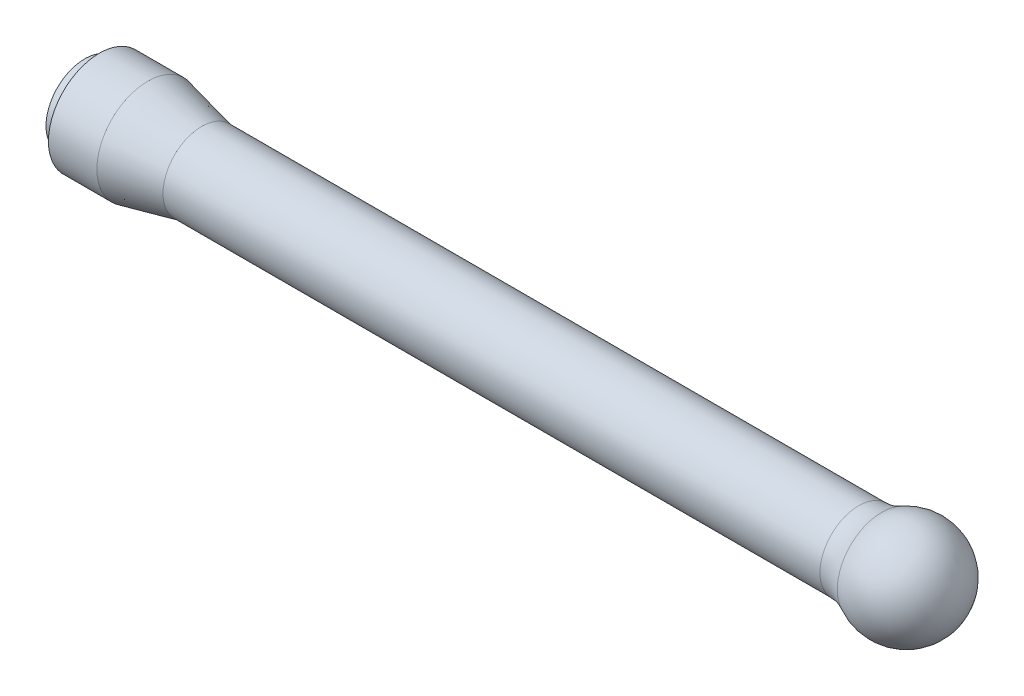
ISO-10303-21;
HEADER;
FILE_DESCRIPTION(('STEP AP214'),'2;1');
FILE_NAME('part.step','',(''),(''),'','','');
FILE_SCHEMA(('AUTOMOTIVE_DESIGN { 1 0 10303 214 1 1 1 1 }'));
ENDSEC;
DATA;
#1=APPLICATION_CONTEXT('core data for automotive mechanical design processes');
#2=APPLICATION_PROTOCOL_DEFINITION('international standard','automotive_design',2000,#1);
#3=PRODUCT_CONTEXT('',#1,'mechanical');
#4=PRODUCT('Part','Part','',(#3));
#5=PRODUCT_RELATED_PRODUCT_CATEGORY('part','',(#4));
#6=PRODUCT_DEFINITION_FORMATION('','',#4);
#7=PRODUCT_DEFINITION_CONTEXT('part definition',#1,'design');
#8=PRODUCT_DEFINITION('design','',#6,#7);
#9=PRODUCT_DEFINITION_SHAPE('','',#8);
#10=(LENGTH_UNIT() NAMED_UNIT(*) SI_UNIT(.MILLI.,.METRE.));
#11=(NAMED_UNIT(*) PLANE_ANGLE_UNIT() SI_UNIT($,.RADIAN.));
#12=(NAMED_UNIT(*) SI_UNIT($,.STERADIAN.) SOLID_ANGLE_UNIT());
#13=UNCERTAINTY_MEASURE_WITH_UNIT(LENGTH_MEASURE(1.E-05),#10,'distance_accuracy_value','');
#14=(GEOMETRIC_REPRESENTATION_CONTEXT(3) GLOBAL_UNCERTAINTY_ASSIGNED_CONTEXT((#13)) GLOBAL_UNIT_ASSIGNED_CONTEXT((#10,
#11,#12)) REPRESENTATION_CONTEXT('',''));
#15=CARTESIAN_POINT('',(0.,0.,0.));
#16=DIRECTION('',(0.,0.,1.));
#17=DIRECTION('',(1.,0.,0.));
#18=AXIS2_PLACEMENT_3D('',#15,#16,#17);
#19=CARTESIAN_POINT('',(0.,0.,0.));
#20=DIRECTION('',(1.,0.,0.));
#21=DIRECTION('',(0.,0.,-1.));
#22=AXIS2_PLACEMENT_3D('',#19,#20,#21);
#23=PLANE('',#22);
#24=CARTESIAN_POINT('',(0.,-2.74999999999996,4.76313972081444));
#25=DIRECTION('',(-1.,0.,0.));
#26=DIRECTION('',(0.,0.,1.));
#27=AXIS2_PLACEMENT_3D('',#24,#25,#26);
#28=CIRCLE('',#27,1.35);
#29=CARTESIAN_POINT('',(0.,-2.74999999999996,6.11313972081444));
#30=VERTEX_POINT('',#29);
#31=EDGE_CURVE('E74',#30,#30,#28,.T.);
#32=ORIENTED_EDGE('',*,*,#31,.F.);
#33=EDGE_LOOP('',(#32));
#34=FACE_BOUND('',#33,.T.);
#35=CARTESIAN_POINT('',(0.,-2.75000000000002,-4.7631397208144));
#36=DIRECTION('',(-1.,0.,0.));
#37=DIRECTION('',(0.,0.,1.));
#38=AXIS2_PLACEMENT_3D('',#35,#36,#37);
#39=CIRCLE('',#38,1.35);
#40=CARTESIAN_POINT('',(0.,-2.75000000000002,-3.4131397208144));
#41=VERTEX_POINT('',#40);
#42=EDGE_CURVE('E67',#41,#41,#39,.T.);
#43=ORIENTED_EDGE('',*,*,#42,.F.);
#44=EDGE_LOOP('',(#43));
#45=FACE_BOUND('',#44,.T.);
#46=CARTESIAN_POINT('',(0.,5.5,0.));
#47=DIRECTION('',(-1.,0.,0.));
#48=DIRECTION('',(0.,0.,1.));
#49=AXIS2_PLACEMENT_3D('',#46,#47,#48);
#50=CIRCLE('',#49,1.35);
#51=CARTESIAN_POINT('',(0.,5.5,1.35));
#52=VERTEX_POINT('',#51);
#53=EDGE_CURVE('E83',#52,#52,#50,.T.);
#54=ORIENTED_EDGE('',*,*,#53,.F.);
#55=EDGE_LOOP('',(#54));
#56=FACE_BOUND('',#55,.T.);
#57=CARTESIAN_POINT('',(0.,0.,0.));
#58=DIRECTION('',(-1.,0.,0.));
#59=DIRECTION('',(0.,0.,1.));
#60=AXIS2_PLACEMENT_3D('',#57,#58,#59);
#61=CIRCLE('',#60,8.);
#62=CARTESIAN_POINT('',(0.,0.,8.));
#63=VERTEX_POINT('',#62);
#64=EDGE_CURVE('E104',#63,#63,#61,.T.);
#65=ORIENTED_EDGE('',*,*,#64,.T.);
#66=EDGE_LOOP('',(#65));
#67=FACE_BOUND('',#66,.T.);
#68=ADVANCED_FACE('F39',(#34,#45,#56,#67),#23,.F.);
#69=CARTESIAN_POINT('',(-57.1321556072254,0.,0.));
#70=DIRECTION('',(-1.,0.,0.));
#71=DIRECTION('',(0.,0.,1.));
#72=AXIS2_PLACEMENT_3D('',#69,#70,#71);
#73=CYLINDRICAL_SURFACE('',#72,8.);
#74=ORIENTED_EDGE('',*,*,#64,.F.);
#75=EDGE_LOOP('',(#74));
#76=FACE_BOUND('',#75,.T.);
#77=CARTESIAN_POINT('',(3.,0.,0.));
#78=DIRECTION('',(-1.,0.,0.));
#79=DIRECTION('',(0.,0.,1.));
#80=AXIS2_PLACEMENT_3D('',#77,#78,#79);
#81=CIRCLE('',#80,8.);
#82=CARTESIAN_POINT('',(3.,0.,8.));
#83=VERTEX_POINT('',#82);
#84=EDGE_CURVE('E101',#83,#83,#81,.T.);
#85=ORIENTED_EDGE('',*,*,#84,.T.);
#86=EDGE_LOOP('',(#85));
#87=FACE_BOUND('',#86,.T.);
#88=ADVANCED_FACE('F122',(#76,#87),#73,.T.);
#89=CARTESIAN_POINT('',(3.,8.,0.));
#90=DIRECTION('',(1.,0.,0.));
#91=DIRECTION('',(0.,0.,-1.));
#92=AXIS2_PLACEMENT_3D('',#89,#90,#91);
#93=PLANE('',#92);
#94=ORIENTED_EDGE('',*,*,#84,.F.);
#95=EDGE_LOOP('',(#94));
#96=FACE_BOUND('',#95,.T.);
#97=CARTESIAN_POINT('',(3.,0.,0.));
#98=DIRECTION('',(-1.,0.,0.));
#99=DIRECTION('',(0.,0.,1.));
#100=AXIS2_PLACEMENT_3D('',#97,#98,#99);
#101=CIRCLE('',#100,10.5);
#102=CARTESIAN_POINT('',(3.,0.,10.5));
#103=VERTEX_POINT('',#102);
#104=EDGE_CURVE('E98',#103,#103,#101,.T.);
#105=ORIENTED_EDGE('',*,*,#104,.T.);
#106=EDGE_LOOP('',(#105));
#107=FACE_BOUND('',#106,.T.);
#108=ADVANCED_FACE('F127',(#96,#107),#93,.F.);
#109=CARTESIAN_POINT('',(-57.1321556072254,0.,0.));
#110=DIRECTION('',(-1.,0.,0.));
#111=DIRECTION('',(0.,0.,1.));
#112=AXIS2_PLACEMENT_3D('',#109,#110,#111);
#113=CYLINDRICAL_SURFACE('',#112,10.5);
#114=ORIENTED_EDGE('',*,*,#104,.F.);
#115=EDGE_LOOP('',(#114));
#116=FACE_BOUND('',#115,.T.);
#117=CARTESIAN_POINT('',(13.,0.,0.));
#118=DIRECTION('',(-1.,0.,0.));
#119=DIRECTION('',(0.,0.,1.));
#120=AXIS2_PLACEMENT_3D('',#117,#118,#119);
#121=CIRCLE('',#120,10.5);
#122=CARTESIAN_POINT('',(13.,0.,10.5));
#123=VERTEX_POINT('',#122);
#124=EDGE_CURVE('E95',#123,#123,#121,.T.);
#125=ORIENTED_EDGE('',*,*,#124,.T.);
#126=EDGE_LOOP('',(#125));
#127=FACE_BOUND('',#126,.T.);
#128=ADVANCED_FACE('F135',(#116,#127),#113,.T.);
#129=CARTESIAN_POINT('',(24.1411008957755,0.,0.));
#130=DIRECTION('',(-1.,0.,0.));
#131=DIRECTION('',(0.,0.,1.));
#132=AXIS2_PLACEMENT_3D('',#129,#130,#131);
#133=CONICAL_SURFACE('',#132,8.,0.220737893227404);
#134=ORIENTED_EDGE('',*,*,#124,.F.);
#135=EDGE_LOOP('',(#134));
#136=FACE_BOUND('',#135,.T.);
#137=CARTESIAN_POINT('',(24.1411008957755,0.,0.));
#138=DIRECTION('',(-1.,0.,0.));
#139=DIRECTION('',(0.,0.,1.));
#140=AXIS2_PLACEMENT_3D('',#137,#138,#139);
#141=CIRCLE('',#140,8.);
#142=CARTESIAN_POINT('',(24.1411008957755,0.,8.));
#143=VERTEX_POINT('',#142);
#144=EDGE_CURVE('E92',#143,#143,#141,.T.);
#145=ORIENTED_EDGE('',*,*,#144,.T.);
#146=EDGE_LOOP('',(#145));
#147=FACE_BOUND('',#146,.T.);
#148=ADVANCED_FACE('F139',(#136,#147),#133,.T.);
#149=CARTESIAN_POINT('',(-57.1321556072254,0.,0.));
#150=DIRECTION('',(-1.,0.,0.));
#151=DIRECTION('',(0.,0.,1.));
#152=AXIS2_PLACEMENT_3D('',#149,#150,#151);
#153=CYLINDRICAL_SURFACE('',#152,8.);
#154=CARTESIAN_POINT('',(159.689291564826,0.,0.));
#155=DIRECTION('',(0.999999999999999,0.,0.));
#156=DIRECTION('',(0.,0.,-1.));
#157=AXIS2_PLACEMENT_3D('',#154,#155,#156);
#158=CIRCLE('',#157,8.);
#159=CARTESIAN_POINT('',(159.689291564826,0.,-8.));
#160=VERTEX_POINT('',#159);
#161=EDGE_CURVE('E47',#160,#160,#158,.F.);
#162=ORIENTED_EDGE('',*,*,#161,.T.);
#163=EDGE_LOOP('',(#162));
#164=FACE_BOUND('',#163,.T.);
#165=ORIENTED_EDGE('',*,*,#144,.F.);
#166=EDGE_LOOP('',(#165));
#167=FACE_BOUND('',#166,.T.);
#168=ADVANCED_FACE('F109',(#164,#167),#153,.T.);
#169=CARTESIAN_POINT('',(169.5,0.,0.));
#170=DIRECTION('',(-1.,0.,0.));
#171=DIRECTION('',(0.,1.,0.));
#172=AXIS2_PLACEMENT_3D('',#169,#170,#171);
#173=SPHERICAL_SURFACE('',#172,10.5);
#174=CARTESIAN_POINT('',(164.475002996618,0.,0.));
#175=DIRECTION('',(0.999999999999999,0.,0.));
#176=DIRECTION('',(0.,0.,-1.));
#177=AXIS2_PLACEMENT_3D('',#174,#175,#176);
#178=CIRCLE('',#177,9.21951219512196);
#179=CARTESIAN_POINT('',(164.475002996618,0.,-9.21951219512196));
#180=VERTEX_POINT('',#179);
#181=EDGE_CURVE('E11',#180,#180,#178,.T.);
#182=ORIENTED_EDGE('',*,*,#181,.T.);
#183=EDGE_LOOP('',(#182));
#184=FACE_BOUND('',#183,.T.);
#185=ADVANCED_FACE('F146',(#184),#173,.T.);
#186=CARTESIAN_POINT('',(4.5,5.5,0.));
#187=DIRECTION('',(-1.,0.,0.));
#188=DIRECTION('',(0.,0.,1.));
#189=AXIS2_PLACEMENT_3D('',#186,#187,#188);
#190=CONICAL_SURFACE('',#189,1.02499999999999,1.02974425867665);
#191=CARTESIAN_POINT('',(5.11588213450325,5.5,0.));
#192=VERTEX_POINT('',#191);
#193=VERTEX_LOOP('',#192);
#194=FACE_BOUND('',#193,.T.);
#195=CARTESIAN_POINT('',(4.5,5.5,0.));
#196=DIRECTION('',(-1.,0.,0.));
#197=DIRECTION('',(0.,0.,1.));
#198=AXIS2_PLACEMENT_3D('',#195,#196,#197);
#199=CIRCLE('',#198,1.02499999999999);
#200=CARTESIAN_POINT('',(4.5,5.5,1.02499999999999));
#201=VERTEX_POINT('',#200);
#202=EDGE_CURVE('E89',#201,#201,#199,.T.);
#203=ORIENTED_EDGE('',*,*,#202,.T.);
#204=EDGE_LOOP('',(#203));
#205=FACE_BOUND('',#204,.T.);
#206=ADVANCED_FACE('F149',(#194,#205),#190,.F.);
#207=CARTESIAN_POINT('',(0.,5.5,0.));
#208=DIRECTION('',(-1.,0.,0.));
#209=DIRECTION('',(0.,0.,1.));
#210=AXIS2_PLACEMENT_3D('',#207,#208,#209);
#211=CYLINDRICAL_SURFACE('',#210,1.02499999999999);
#212=ORIENTED_EDGE('',*,*,#202,.F.);
#213=EDGE_LOOP('',(#212));
#214=FACE_BOUND('',#213,.T.);
#215=CARTESIAN_POINT('',(0.325000000000001,5.5,0.));
#216=DIRECTION('',(-1.,0.,0.));
#217=DIRECTION('',(0.,0.,1.));
#218=AXIS2_PLACEMENT_3D('',#215,#216,#217);
#219=CIRCLE('',#218,1.025);
#220=CARTESIAN_POINT('',(0.325000000000001,5.5,1.025));
#221=VERTEX_POINT('',#220);
#222=EDGE_CURVE('E86',#221,#221,#219,.T.);
#223=ORIENTED_EDGE('',*,*,#222,.T.);
#224=EDGE_LOOP('',(#223));
#225=FACE_BOUND('',#224,.T.);
#226=ADVANCED_FACE('F153',(#214,#225),#211,.F.);
#227=CARTESIAN_POINT('',(0.,5.5,0.));
#228=DIRECTION('',(-1.,0.,0.));
#229=DIRECTION('',(0.,0.,1.));
#230=AXIS2_PLACEMENT_3D('',#227,#228,#229);
#231=CONICAL_SURFACE('',#230,1.35,0.78539816339745);
#232=ORIENTED_EDGE('',*,*,#222,.F.);
#233=EDGE_LOOP('',(#232));
#234=FACE_BOUND('',#233,.T.);
#235=ORIENTED_EDGE('',*,*,#53,.T.);
#236=EDGE_LOOP('',(#235));
#237=FACE_BOUND('',#236,.T.);
#238=ADVANCED_FACE('F156',(#234,#237),#231,.F.);
#239=CARTESIAN_POINT('',(4.5,-2.75000000000002,-4.7631397208144));
#240=DIRECTION('',(-1.,0.,0.));
#241=DIRECTION('',(0.,0.,1.));
#242=AXIS2_PLACEMENT_3D('',#239,#240,#241);
#243=CONICAL_SURFACE('',#242,1.02499999999999,1.02974425867665);
#244=CARTESIAN_POINT('',(5.11588213450325,-2.75000000000002,-4.7631397208144));
#245=VERTEX_POINT('',#244);
#246=VERTEX_LOOP('',#245);
#247=FACE_BOUND('',#246,.T.);
#248=CARTESIAN_POINT('',(4.5,-2.75000000000002,-4.7631397208144));
#249=DIRECTION('',(-1.,0.,0.));
#250=DIRECTION('',(0.,0.,1.));
#251=AXIS2_PLACEMENT_3D('',#248,#249,#250);
#252=CIRCLE('',#251,1.02499999999999);
#253=CARTESIAN_POINT('',(4.5,-2.75000000000002,-3.73813972081441));
#254=VERTEX_POINT('',#253);
#255=EDGE_CURVE('E80',#254,#254,#252,.T.);
#256=ORIENTED_EDGE('',*,*,#255,.T.);
#257=EDGE_LOOP('',(#256));
#258=FACE_BOUND('',#257,.T.);
#259=ADVANCED_FACE('F160',(#247,#258),#243,.F.);
#260=CARTESIAN_POINT('',(0.,-2.75000000000002,-4.7631397208144));
#261=DIRECTION('',(-1.,0.,0.));
#262=DIRECTION('',(0.,0.,1.));
#263=AXIS2_PLACEMENT_3D('',#260,#261,#262);
#264=CYLINDRICAL_SURFACE('',#263,1.02499999999999);
#265=ORIENTED_EDGE('',*,*,#255,.F.);
#266=EDGE_LOOP('',(#265));
#267=FACE_BOUND('',#266,.T.);
#268=CARTESIAN_POINT('',(0.325000000000001,-2.75000000000002,-4.7631397208144));
#269=DIRECTION('',(-1.,0.,0.));
#270=DIRECTION('',(0.,0.,1.));
#271=AXIS2_PLACEMENT_3D('',#268,#269,#270);
#272=CIRCLE('',#271,1.025);
#273=CARTESIAN_POINT('',(0.325000000000001,-2.75000000000002,-3.7381397208144));
#274=VERTEX_POINT('',#273);
#275=EDGE_CURVE('E71',#274,#274,#272,.T.);
#276=ORIENTED_EDGE('',*,*,#275,.T.);
#277=EDGE_LOOP('',(#276));
#278=FACE_BOUND('',#277,.T.);
#279=ADVANCED_FACE('F164',(#267,#278),#264,.F.);
#280=CARTESIAN_POINT('',(0.,-2.75000000000002,-4.7631397208144));
#281=DIRECTION('',(-1.,0.,0.));
#282=DIRECTION('',(0.,0.,1.));
#283=AXIS2_PLACEMENT_3D('',#280,#281,#282);
#284=CONICAL_SURFACE('',#283,1.35,0.785398163397449);
#285=ORIENTED_EDGE('',*,*,#275,.F.);
#286=EDGE_LOOP('',(#285));
#287=FACE_BOUND('',#286,.T.);
#288=ORIENTED_EDGE('',*,*,#42,.T.);
#289=EDGE_LOOP('',(#288));
#290=FACE_BOUND('',#289,.T.);
#291=ADVANCED_FACE('F61',(#287,#290),#284,.F.);
#292=CARTESIAN_POINT('',(4.5,-2.74999999999996,4.76313972081444));
#293=DIRECTION('',(-1.,0.,0.));
#294=DIRECTION('',(0.,0.,1.));
#295=AXIS2_PLACEMENT_3D('',#292,#293,#294);
#296=CONICAL_SURFACE('',#295,1.02499999999999,1.02974425867665);
#297=CARTESIAN_POINT('',(5.11588213450325,-2.74999999999996,4.76313972081444));
#298=VERTEX_POINT('',#297);
#299=VERTEX_LOOP('',#298);
#300=FACE_BOUND('',#299,.T.);
#301=CARTESIAN_POINT('',(4.5,-2.74999999999996,4.76313972081444));
#302=DIRECTION('',(-1.,0.,0.));
#303=DIRECTION('',(0.,0.,1.));
#304=AXIS2_PLACEMENT_3D('',#301,#302,#303);
#305=CIRCLE('',#304,1.02499999999999);
#306=CARTESIAN_POINT('',(4.5,-2.74999999999996,5.78813972081443));
#307=VERTEX_POINT('',#306);
#308=EDGE_CURVE('E65',#307,#307,#305,.T.);
#309=ORIENTED_EDGE('',*,*,#308,.T.);
#310=EDGE_LOOP('',(#309));
#311=FACE_BOUND('',#310,.T.);
#312=ADVANCED_FACE('F57',(#300,#311),#296,.F.);
#313=CARTESIAN_POINT('',(0.,-2.74999999999996,4.76313972081444));
#314=DIRECTION('',(-1.,0.,0.));
#315=DIRECTION('',(0.,0.,1.));
#316=AXIS2_PLACEMENT_3D('',#313,#314,#315);
#317=CYLINDRICAL_SURFACE('',#316,1.02499999999999);
#318=ORIENTED_EDGE('',*,*,#308,.F.);
#319=EDGE_LOOP('',(#318));
#320=FACE_BOUND('',#319,.T.);
#321=CARTESIAN_POINT('',(0.325000000000001,-2.74999999999996,4.76313972081444));
#322=DIRECTION('',(-1.,0.,0.));
#323=DIRECTION('',(0.,0.,1.));
#324=AXIS2_PLACEMENT_3D('',#321,#322,#323);
#325=CIRCLE('',#324,1.025);
#326=CARTESIAN_POINT('',(0.325000000000001,-2.74999999999996,5.78813972081444));
#327=VERTEX_POINT('',#326);
#328=EDGE_CURVE('E68',#327,#327,#325,.T.);
#329=ORIENTED_EDGE('',*,*,#328,.T.);
#330=EDGE_LOOP('',(#329));
#331=FACE_BOUND('',#330,.T.);
#332=ADVANCED_FACE('F60',(#320,#331),#317,.F.);
#333=CARTESIAN_POINT('',(0.,-2.74999999999996,4.76313972081444));
#334=DIRECTION('',(-1.,0.,0.));
#335=DIRECTION('',(0.,0.,1.));
#336=AXIS2_PLACEMENT_3D('',#333,#334,#335);
#337=CONICAL_SURFACE('',#336,1.35,0.785398163397449);
#338=ORIENTED_EDGE('',*,*,#328,.F.);
#339=EDGE_LOOP('',(#338));
#340=FACE_BOUND('',#339,.T.);
#341=ORIENTED_EDGE('',*,*,#31,.T.);
#342=EDGE_LOOP('',(#341));
#343=FACE_BOUND('',#342,.T.);
#344=ADVANCED_FACE('F113',(#340,#343),#337,.F.);
#345=CARTESIAN_POINT('',(159.689291564826,0.,0.));
#346=DIRECTION('',(0.999999999999999,0.,0.));
#347=DIRECTION('',(0.,0.,-1.));
#348=AXIS2_PLACEMENT_3D('',#345,#346,#347);
#349=TOROIDAL_SURFACE('',#348,18.,10.);
#350=ORIENTED_EDGE('',*,*,#181,.F.);
#351=EDGE_LOOP('',(#350));
#352=FACE_BOUND('',#351,.T.);
#353=ORIENTED_EDGE('',*,*,#161,.F.);
#354=EDGE_LOOP('',(#353));
#355=FACE_BOUND('',#354,.T.);
#356=ADVANCED_FACE('F41',(#352,#355),#349,.F.);
#357=CLOSED_SHELL('',(#68,#88,#108,#128,#148,#168,#185,#206,#226,#238,#259,#279,#291,#312,#332,
#344,#356));
#358=MANIFOLD_SOLID_BREP('B2',#357);
#359=ADVANCED_BREP_SHAPE_REPRESENTATION('',(#18,#358),#14);
#360=SHAPE_DEFINITION_REPRESENTATION(#9,#359);
ENDSEC;
END-ISO-10303-21;
